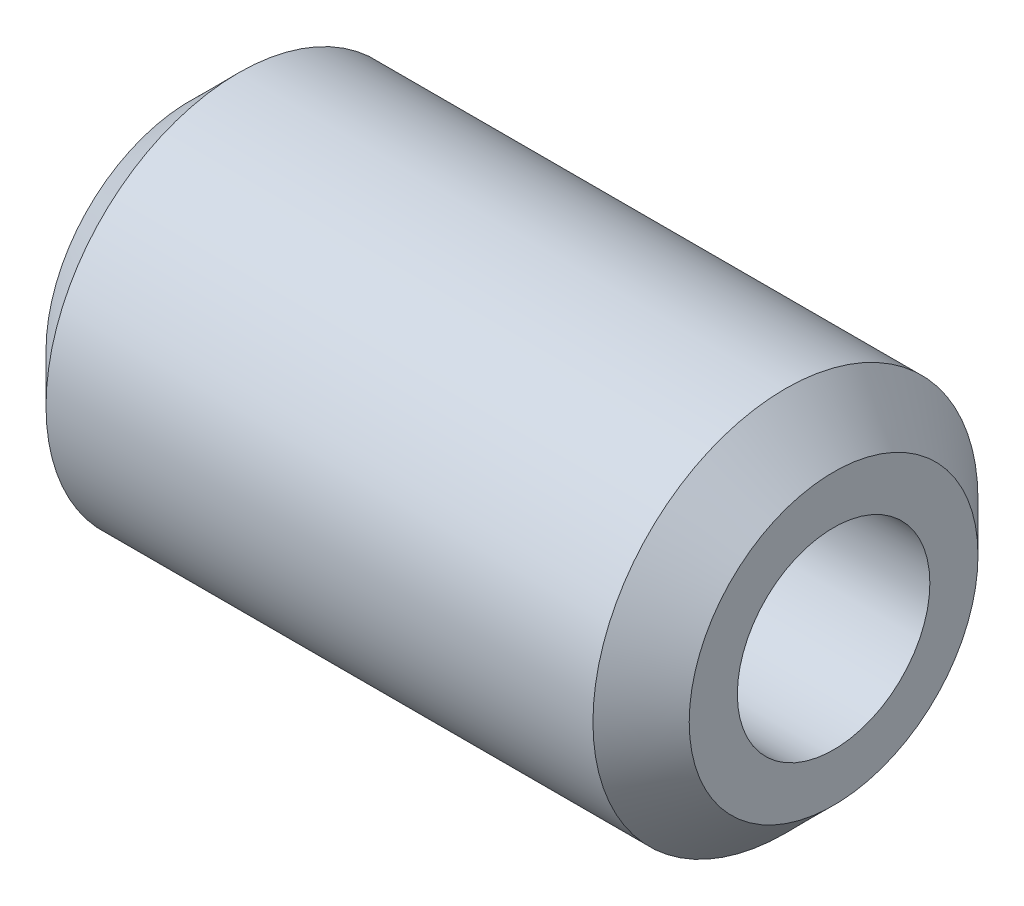
ISO-10303-21;
HEADER;
FILE_DESCRIPTION(('STEP AP214'),'2;1');
FILE_NAME('part.step','',(''),(''),'','','');
FILE_SCHEMA(('AUTOMOTIVE_DESIGN { 1 0 10303 214 1 1 1 1 }'));
ENDSEC;
DATA;
#1=APPLICATION_CONTEXT('core data for automotive mechanical design processes');
#2=APPLICATION_PROTOCOL_DEFINITION('international standard','automotive_design',2000,#1);
#3=PRODUCT_CONTEXT('',#1,'mechanical');
#4=PRODUCT('Part','Part','',(#3));
#5=PRODUCT_RELATED_PRODUCT_CATEGORY('part','',(#4));
#6=PRODUCT_DEFINITION_FORMATION('','',#4);
#7=PRODUCT_DEFINITION_CONTEXT('part definition',#1,'design');
#8=PRODUCT_DEFINITION('design','',#6,#7);
#9=PRODUCT_DEFINITION_SHAPE('','',#8);
#10=(LENGTH_UNIT() NAMED_UNIT(*) SI_UNIT(.MILLI.,.METRE.));
#11=(NAMED_UNIT(*) PLANE_ANGLE_UNIT() SI_UNIT($,.RADIAN.));
#12=(NAMED_UNIT(*) SI_UNIT($,.STERADIAN.) SOLID_ANGLE_UNIT());
#13=UNCERTAINTY_MEASURE_WITH_UNIT(LENGTH_MEASURE(1.E-05),#10,'distance_accuracy_value','');
#14=(GEOMETRIC_REPRESENTATION_CONTEXT(3) GLOBAL_UNCERTAINTY_ASSIGNED_CONTEXT((#13)) GLOBAL_UNIT_ASSIGNED_CONTEXT((#10,
#11,#12)) REPRESENTATION_CONTEXT('',''));
#15=CARTESIAN_POINT('',(0.,0.,0.));
#16=DIRECTION('',(0.,0.,1.));
#17=DIRECTION('',(1.,0.,0.));
#18=AXIS2_PLACEMENT_3D('',#15,#16,#17);
#19=CARTESIAN_POINT('',(-73.003968472948,0.,0.));
#20=DIRECTION('',(-1.,0.,0.));
#21=DIRECTION('',(0.,0.,1.));
#22=AXIS2_PLACEMENT_3D('',#19,#20,#21);
#23=CYLINDRICAL_SURFACE('',#22,5.49999999999999);
#24=CARTESIAN_POINT('',(18.375,0.,0.));
#25=DIRECTION('',(-1.,0.,0.));
#26=DIRECTION('',(0.,0.,1.));
#27=AXIS2_PLACEMENT_3D('',#24,#25,#26);
#28=CIRCLE('',#27,5.49999999999999);
#29=CARTESIAN_POINT('',(18.375,0.,5.49999999999999));
#30=VERTEX_POINT('',#29);
#31=EDGE_CURVE('E53',#30,#30,#28,.T.);
#32=ORIENTED_EDGE('',*,*,#31,.F.);
#33=EDGE_LOOP('',(#32));
#34=FACE_BOUND('',#33,.T.);
#35=CARTESIAN_POINT('',(-18.375,0.,0.));
#36=DIRECTION('',(-1.,0.,0.));
#37=DIRECTION('',(0.,0.,1.));
#38=AXIS2_PLACEMENT_3D('',#35,#36,#37);
#39=CIRCLE('',#38,5.49999999999999);
#40=CARTESIAN_POINT('',(-18.375,0.,5.49999999999999));
#41=VERTEX_POINT('',#40);
#42=EDGE_CURVE('E10',#41,#41,#39,.T.);
#43=ORIENTED_EDGE('',*,*,#42,.T.);
#44=EDGE_LOOP('',(#43));
#45=FACE_BOUND('',#44,.T.);
#46=ADVANCED_FACE('F31',(#34,#45),#23,.F.);
#47=CARTESIAN_POINT('',(-18.375,5.49999999999999,0.));
#48=DIRECTION('',(1.,0.,0.));
#49=DIRECTION('',(0.,0.,-1.));
#50=AXIS2_PLACEMENT_3D('',#47,#48,#49);
#51=PLANE('',#50);
#52=ORIENTED_EDGE('',*,*,#42,.F.);
#53=EDGE_LOOP('',(#52));
#54=FACE_BOUND('',#53,.T.);
#55=CARTESIAN_POINT('',(-18.375,0.,0.));
#56=DIRECTION('',(-1.,0.,0.));
#57=DIRECTION('',(0.,0.,1.));
#58=AXIS2_PLACEMENT_3D('',#55,#56,#57);
#59=CIRCLE('',#58,8.25);
#60=CARTESIAN_POINT('',(-18.375,0.,8.25));
#61=VERTEX_POINT('',#60);
#62=EDGE_CURVE('E37',#61,#61,#59,.T.);
#63=ORIENTED_EDGE('',*,*,#62,.T.);
#64=EDGE_LOOP('',(#63));
#65=FACE_BOUND('',#64,.T.);
#66=ADVANCED_FACE('F60',(#54,#65),#51,.F.);
#67=CARTESIAN_POINT('',(-15.625,0.,0.));
#68=DIRECTION('',(1.,0.,0.));
#69=DIRECTION('',(0.,0.,-1.));
#70=AXIS2_PLACEMENT_3D('',#67,#68,#69);
#71=CONICAL_SURFACE('',#70,11.,0.78539816339745);
#72=ORIENTED_EDGE('',*,*,#62,.F.);
#73=EDGE_LOOP('',(#72));
#74=FACE_BOUND('',#73,.T.);
#75=CARTESIAN_POINT('',(-15.625,0.,0.));
#76=DIRECTION('',(-1.,0.,0.));
#77=DIRECTION('',(0.,0.,1.));
#78=AXIS2_PLACEMENT_3D('',#75,#76,#77);
#79=CIRCLE('',#78,11.);
#80=CARTESIAN_POINT('',(-15.625,0.,11.));
#81=VERTEX_POINT('',#80);
#82=EDGE_CURVE('E41',#81,#81,#79,.T.);
#83=ORIENTED_EDGE('',*,*,#82,.T.);
#84=EDGE_LOOP('',(#83));
#85=FACE_BOUND('',#84,.T.);
#86=ADVANCED_FACE('F64',(#74,#85),#71,.T.);
#87=CARTESIAN_POINT('',(-73.003968472948,0.,0.));
#88=DIRECTION('',(-1.,0.,0.));
#89=DIRECTION('',(0.,0.,1.));
#90=AXIS2_PLACEMENT_3D('',#87,#88,#89);
#91=CYLINDRICAL_SURFACE('',#90,11.);
#92=ORIENTED_EDGE('',*,*,#82,.F.);
#93=EDGE_LOOP('',(#92));
#94=FACE_BOUND('',#93,.T.);
#95=CARTESIAN_POINT('',(15.625,0.,0.));
#96=DIRECTION('',(-1.,0.,0.));
#97=DIRECTION('',(0.,0.,1.));
#98=AXIS2_PLACEMENT_3D('',#95,#96,#97);
#99=CIRCLE('',#98,11.);
#100=CARTESIAN_POINT('',(15.625,0.,11.));
#101=VERTEX_POINT('',#100);
#102=EDGE_CURVE('E45',#101,#101,#99,.T.);
#103=ORIENTED_EDGE('',*,*,#102,.T.);
#104=EDGE_LOOP('',(#103));
#105=FACE_BOUND('',#104,.T.);
#106=ADVANCED_FACE('F69',(#94,#105),#91,.T.);
#107=CARTESIAN_POINT('',(18.375,0.,0.));
#108=DIRECTION('',(-1.,0.,0.));
#109=DIRECTION('',(0.,0.,1.));
#110=AXIS2_PLACEMENT_3D('',#107,#108,#109);
#111=CONICAL_SURFACE('',#110,8.25,0.78539816339745);
#112=ORIENTED_EDGE('',*,*,#102,.F.);
#113=EDGE_LOOP('',(#112));
#114=FACE_BOUND('',#113,.T.);
#115=CARTESIAN_POINT('',(18.375,0.,0.));
#116=DIRECTION('',(-1.,0.,0.));
#117=DIRECTION('',(0.,0.,1.));
#118=AXIS2_PLACEMENT_3D('',#115,#116,#117);
#119=CIRCLE('',#118,8.25);
#120=CARTESIAN_POINT('',(18.375,0.,8.25));
#121=VERTEX_POINT('',#120);
#122=EDGE_CURVE('E50',#121,#121,#119,.T.);
#123=ORIENTED_EDGE('',*,*,#122,.T.);
#124=EDGE_LOOP('',(#123));
#125=FACE_BOUND('',#124,.T.);
#126=ADVANCED_FACE('F75',(#114,#125),#111,.T.);
#127=CARTESIAN_POINT('',(18.375,8.25,0.));
#128=DIRECTION('',(-1.,0.,0.));
#129=DIRECTION('',(0.,0.,1.));
#130=AXIS2_PLACEMENT_3D('',#127,#128,#129);
#131=PLANE('',#130);
#132=ORIENTED_EDGE('',*,*,#122,.F.);
#133=EDGE_LOOP('',(#132));
#134=FACE_BOUND('',#133,.T.);
#135=ORIENTED_EDGE('',*,*,#31,.T.);
#136=EDGE_LOOP('',(#135));
#137=FACE_BOUND('',#136,.T.);
#138=ADVANCED_FACE('F57',(#134,#137),#131,.F.);
#139=CLOSED_SHELL('',(#46,#66,#86,#106,#126,#138));
#140=MANIFOLD_SOLID_BREP('B2',#139);
#141=ADVANCED_BREP_SHAPE_REPRESENTATION('',(#18,#140),#14);
#142=SHAPE_DEFINITION_REPRESENTATION(#9,#141);
ENDSEC;
END-ISO-10303-21;
